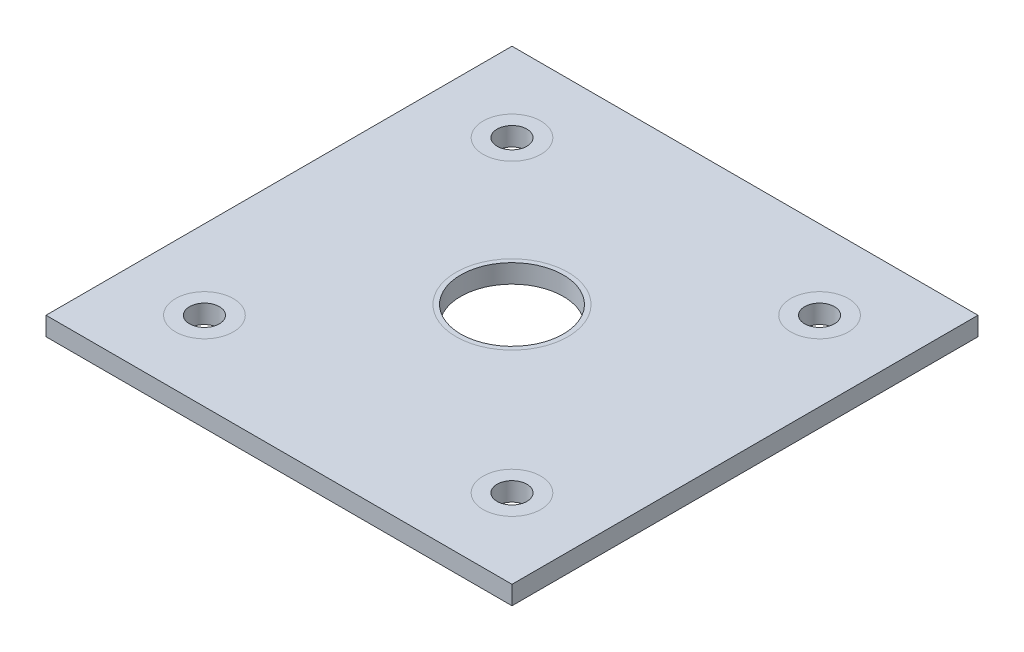
ISO-10303-21;
HEADER;
FILE_DESCRIPTION(('STEP AP214'),'2;1');
FILE_NAME('part.step','',(''),(''),'','','');
FILE_SCHEMA(('AUTOMOTIVE_DESIGN { 1 0 10303 214 1 1 1 1 }'));
ENDSEC;
DATA;
#1=APPLICATION_CONTEXT('core data for automotive mechanical design processes');
#2=APPLICATION_PROTOCOL_DEFINITION('international standard','automotive_design',2000,#1);
#3=PRODUCT_CONTEXT('',#1,'mechanical');
#4=PRODUCT('Part','Part','',(#3));
#5=PRODUCT_RELATED_PRODUCT_CATEGORY('part','',(#4));
#6=PRODUCT_DEFINITION_FORMATION('','',#4);
#7=PRODUCT_DEFINITION_CONTEXT('part definition',#1,'design');
#8=PRODUCT_DEFINITION('design','',#6,#7);
#9=PRODUCT_DEFINITION_SHAPE('','',#8);
#10=(LENGTH_UNIT() NAMED_UNIT(*) SI_UNIT(.MILLI.,.METRE.));
#11=(NAMED_UNIT(*) PLANE_ANGLE_UNIT() SI_UNIT($,.RADIAN.));
#12=(NAMED_UNIT(*) SI_UNIT($,.STERADIAN.) SOLID_ANGLE_UNIT());
#13=UNCERTAINTY_MEASURE_WITH_UNIT(LENGTH_MEASURE(1.E-05),#10,'distance_accuracy_value','');
#14=(GEOMETRIC_REPRESENTATION_CONTEXT(3) GLOBAL_UNCERTAINTY_ASSIGNED_CONTEXT((#13)) GLOBAL_UNIT_ASSIGNED_CONTEXT((#10,
#11,#12)) REPRESENTATION_CONTEXT('',''));
#15=CARTESIAN_POINT('',(0.,0.,0.));
#16=DIRECTION('',(0.,0.,1.));
#17=DIRECTION('',(1.,0.,0.));
#18=AXIS2_PLACEMENT_3D('',#15,#16,#17);
#19=CARTESIAN_POINT('',(23.252688172043,-2.,-35.013440860215));
#20=DIRECTION('',(0.,1.,0.));
#21=DIRECTION('',(0.,0.,1.));
#22=AXIS2_PLACEMENT_3D('',#19,#20,#21);
#23=PLANE('',#22);
#24=CARTESIAN_POINT('',(8.5,-2.,-41.5));
#25=DIRECTION('',(0.,1.,0.));
#26=DIRECTION('',(0.,0.,1.));
#27=AXIS2_PLACEMENT_3D('',#24,#25,#26);
#28=CIRCLE('',#27,3.1);
#29=CARTESIAN_POINT('',(8.5,-2.,-38.4));
#30=VERTEX_POINT('',#29);
#31=EDGE_CURVE('E148',#30,#30,#28,.F.);
#32=ORIENTED_EDGE('',*,*,#31,.F.);
#33=EDGE_LOOP('',(#32));
#34=FACE_BOUND('',#33,.T.);
#35=CARTESIAN_POINT('',(41.5,-2.,-8.50000000000035));
#36=DIRECTION('',(0.,1.,0.));
#37=DIRECTION('',(0.,0.,1.));
#38=AXIS2_PLACEMENT_3D('',#35,#36,#37);
#39=CIRCLE('',#38,3.1);
#40=CARTESIAN_POINT('',(41.5,-2.,-5.40000000000035));
#41=VERTEX_POINT('',#40);
#42=EDGE_CURVE('E132',#41,#41,#39,.F.);
#43=ORIENTED_EDGE('',*,*,#42,.F.);
#44=EDGE_LOOP('',(#43));
#45=FACE_BOUND('',#44,.T.);
#46=DIRECTION('',(0.,0.,1.));
#47=VECTOR('',#46,1.);
#48=CARTESIAN_POINT('',(0.,-2.,-50.));
#49=LINE('',#48,#47);
#50=CARTESIAN_POINT('',(0.,-2.,-50.));
#51=VERTEX_POINT('',#50);
#52=CARTESIAN_POINT('',(0.,-2.,0.));
#53=VERTEX_POINT('',#52);
#54=EDGE_CURVE('E113',#51,#53,#49,.T.);
#55=ORIENTED_EDGE('',*,*,#54,.F.);
#56=DIRECTION('',(-1.,0.,0.));
#57=VECTOR('',#56,1.);
#58=CARTESIAN_POINT('',(0.,-2.,-50.));
#59=LINE('',#58,#57);
#60=CARTESIAN_POINT('',(50.,-2.,-50.));
#61=VERTEX_POINT('',#60);
#62=EDGE_CURVE('E84',#61,#51,#59,.T.);
#63=ORIENTED_EDGE('',*,*,#62,.F.);
#64=DIRECTION('',(0.,0.,-1.));
#65=VECTOR('',#64,1.);
#66=CARTESIAN_POINT('',(50.,-2.,-50.));
#67=LINE('',#66,#65);
#68=CARTESIAN_POINT('',(50.,-2.,0.));
#69=VERTEX_POINT('',#68);
#70=EDGE_CURVE('E78',#69,#61,#67,.T.);
#71=ORIENTED_EDGE('',*,*,#70,.F.);
#72=DIRECTION('',(1.,0.,0.));
#73=VECTOR('',#72,1.);
#74=CARTESIAN_POINT('',(0.,-2.,0.));
#75=LINE('',#74,#73);
#76=EDGE_CURVE('E103',#53,#69,#75,.T.);
#77=ORIENTED_EDGE('',*,*,#76,.F.);
#78=EDGE_LOOP('',(#55,#63,#71,#77));
#79=FACE_BOUND('',#78,.T.);
#80=CARTESIAN_POINT('',(8.50000000000029,-2.,-8.50000000000017));
#81=DIRECTION('',(0.,1.,0.));
#82=DIRECTION('',(0.,0.,1.));
#83=AXIS2_PLACEMENT_3D('',#80,#81,#82);
#84=CIRCLE('',#83,3.1);
#85=CARTESIAN_POINT('',(8.50000000000029,-2.,-5.40000000000017));
#86=VERTEX_POINT('',#85);
#87=EDGE_CURVE('E124',#86,#86,#84,.F.);
#88=ORIENTED_EDGE('',*,*,#87,.F.);
#89=EDGE_LOOP('',(#88));
#90=FACE_BOUND('',#89,.T.);
#91=CARTESIAN_POINT('',(41.5,-2.,-41.5));
#92=DIRECTION('',(0.,1.,0.));
#93=DIRECTION('',(0.,0.,1.));
#94=AXIS2_PLACEMENT_3D('',#91,#92,#93);
#95=CIRCLE('',#94,3.1);
#96=CARTESIAN_POINT('',(41.5,-2.,-38.4));
#97=VERTEX_POINT('',#96);
#98=EDGE_CURVE('E140',#97,#97,#95,.F.);
#99=ORIENTED_EDGE('',*,*,#98,.F.);
#100=EDGE_LOOP('',(#99));
#101=FACE_BOUND('',#100,.T.);
#102=CARTESIAN_POINT('',(24.,-2.,-26.));
#103=DIRECTION('',(0.,1.,0.));
#104=DIRECTION('',(0.,0.,1.));
#105=AXIS2_PLACEMENT_3D('',#102,#103,#104);
#106=CIRCLE('',#105,6.00000000000001);
#107=CARTESIAN_POINT('',(24.,-2.,-20.));
#108=VERTEX_POINT('',#107);
#109=EDGE_CURVE('E11',#108,#108,#106,.F.);
#110=ORIENTED_EDGE('',*,*,#109,.F.);
#111=EDGE_LOOP('',(#110));
#112=FACE_BOUND('',#111,.T.);
#113=ADVANCED_FACE('F43',(#34,#45,#79,#90,#101,#112),#23,.F.);
#114=CARTESIAN_POINT('',(23.252688172043,0.,-35.013440860215));
#115=DIRECTION('',(0.,1.,0.));
#116=DIRECTION('',(0.,0.,1.));
#117=AXIS2_PLACEMENT_3D('',#114,#115,#116);
#118=PLANE('',#117);
#119=CARTESIAN_POINT('',(8.5,0.,-41.5));
#120=DIRECTION('',(0.,1.,0.));
#121=DIRECTION('',(0.,0.,1.));
#122=AXIS2_PLACEMENT_3D('',#119,#120,#121);
#123=CIRCLE('',#122,3.1);
#124=CARTESIAN_POINT('',(8.5,0.,-38.4));
#125=VERTEX_POINT('',#124);
#126=EDGE_CURVE('E144',#125,#125,#123,.F.);
#127=ORIENTED_EDGE('',*,*,#126,.T.);
#128=EDGE_LOOP('',(#127));
#129=FACE_BOUND('',#128,.T.);
#130=CARTESIAN_POINT('',(41.5,0.,-8.50000000000035));
#131=DIRECTION('',(0.,1.,0.));
#132=DIRECTION('',(0.,0.,1.));
#133=AXIS2_PLACEMENT_3D('',#130,#131,#132);
#134=CIRCLE('',#133,3.1);
#135=CARTESIAN_POINT('',(41.5,0.,-5.40000000000035));
#136=VERTEX_POINT('',#135);
#137=EDGE_CURVE('E128',#136,#136,#134,.F.);
#138=ORIENTED_EDGE('',*,*,#137,.T.);
#139=EDGE_LOOP('',(#138));
#140=FACE_BOUND('',#139,.T.);
#141=DIRECTION('',(0.,0.,1.));
#142=VECTOR('',#141,1.);
#143=CARTESIAN_POINT('',(0.,0.,-50.));
#144=LINE('',#143,#142);
#145=CARTESIAN_POINT('',(0.,0.,-50.));
#146=VERTEX_POINT('',#145);
#147=CARTESIAN_POINT('',(0.,0.,0.));
#148=VERTEX_POINT('',#147);
#149=EDGE_CURVE('E98',#146,#148,#144,.T.);
#150=ORIENTED_EDGE('',*,*,#149,.T.);
#151=DIRECTION('',(1.,0.,0.));
#152=VECTOR('',#151,1.);
#153=CARTESIAN_POINT('',(0.,0.,0.));
#154=LINE('',#153,#152);
#155=CARTESIAN_POINT('',(50.,0.,0.));
#156=VERTEX_POINT('',#155);
#157=EDGE_CURVE('E92',#148,#156,#154,.T.);
#158=ORIENTED_EDGE('',*,*,#157,.T.);
#159=DIRECTION('',(0.,0.,-1.));
#160=VECTOR('',#159,1.);
#161=CARTESIAN_POINT('',(50.,0.,-50.));
#162=LINE('',#161,#160);
#163=CARTESIAN_POINT('',(50.,0.,-50.));
#164=VERTEX_POINT('',#163);
#165=EDGE_CURVE('E96',#156,#164,#162,.T.);
#166=ORIENTED_EDGE('',*,*,#165,.T.);
#167=DIRECTION('',(-1.,0.,0.));
#168=VECTOR('',#167,1.);
#169=CARTESIAN_POINT('',(0.,0.,-50.));
#170=LINE('',#169,#168);
#171=EDGE_CURVE('E61',#164,#146,#170,.T.);
#172=ORIENTED_EDGE('',*,*,#171,.T.);
#173=EDGE_LOOP('',(#150,#158,#166,#172));
#174=FACE_BOUND('',#173,.T.);
#175=CARTESIAN_POINT('',(8.50000000000029,0.,-8.50000000000017));
#176=DIRECTION('',(0.,1.,0.));
#177=DIRECTION('',(0.,0.,1.));
#178=AXIS2_PLACEMENT_3D('',#175,#176,#177);
#179=CIRCLE('',#178,3.1);
#180=CARTESIAN_POINT('',(8.50000000000029,0.,-5.40000000000017));
#181=VERTEX_POINT('',#180);
#182=EDGE_CURVE('E123',#181,#181,#179,.F.);
#183=ORIENTED_EDGE('',*,*,#182,.T.);
#184=EDGE_LOOP('',(#183));
#185=FACE_BOUND('',#184,.T.);
#186=CARTESIAN_POINT('',(41.5,0.,-41.5));
#187=DIRECTION('',(0.,1.,0.));
#188=DIRECTION('',(0.,0.,1.));
#189=AXIS2_PLACEMENT_3D('',#186,#187,#188);
#190=CIRCLE('',#189,3.1);
#191=CARTESIAN_POINT('',(41.5,0.,-38.4));
#192=VERTEX_POINT('',#191);
#193=EDGE_CURVE('E136',#192,#192,#190,.F.);
#194=ORIENTED_EDGE('',*,*,#193,.T.);
#195=EDGE_LOOP('',(#194));
#196=FACE_BOUND('',#195,.T.);
#197=CARTESIAN_POINT('',(24.,0.,-26.));
#198=DIRECTION('',(0.,1.,0.));
#199=DIRECTION('',(0.,0.,1.));
#200=AXIS2_PLACEMENT_3D('',#197,#198,#199);
#201=CIRCLE('',#200,6.00000000000001);
#202=CARTESIAN_POINT('',(24.,0.,-20.));
#203=VERTEX_POINT('',#202);
#204=EDGE_CURVE('E47',#203,#203,#201,.F.);
#205=ORIENTED_EDGE('',*,*,#204,.T.);
#206=EDGE_LOOP('',(#205));
#207=FACE_BOUND('',#206,.T.);
#208=ADVANCED_FACE('F93',(#129,#140,#174,#185,#196,#207),#118,.T.);
#209=ORIENTED_EDGE('',*,*,#109,.T.);
#210=EDGE_LOOP('',(#209));
#211=FACE_BOUND('',#210,.T.);
#212=CARTESIAN_POINT('',(24.,-2.,-26.));
#213=DIRECTION('',(0.,1.,0.));
#214=DIRECTION('',(0.,0.,1.));
#215=AXIS2_PLACEMENT_3D('',#212,#213,#214);
#216=CIRCLE('',#215,5.5);
#217=CARTESIAN_POINT('',(24.,-2.,-20.5));
#218=VERTEX_POINT('',#217);
#219=EDGE_CURVE('E116',#218,#218,#216,.T.);
#220=ORIENTED_EDGE('',*,*,#219,.T.);
#221=EDGE_LOOP('',(#220));
#222=FACE_BOUND('',#221,.T.);
#223=ADVANCED_FACE('F204',(#211,#222),#23,.F.);
#224=ORIENTED_EDGE('',*,*,#204,.F.);
#225=EDGE_LOOP('',(#224));
#226=FACE_BOUND('',#225,.T.);
#227=CARTESIAN_POINT('',(24.,0.,-26.));
#228=DIRECTION('',(0.,1.,0.));
#229=DIRECTION('',(0.,0.,1.));
#230=AXIS2_PLACEMENT_3D('',#227,#228,#229);
#231=CIRCLE('',#230,5.5);
#232=CARTESIAN_POINT('',(24.,0.,-20.5));
#233=VERTEX_POINT('',#232);
#234=EDGE_CURVE('E195',#233,#233,#231,.T.);
#235=ORIENTED_EDGE('',*,*,#234,.F.);
#236=EDGE_LOOP('',(#235));
#237=FACE_BOUND('',#236,.T.);
#238=ADVANCED_FACE('F167',(#226,#237),#118,.T.);
#239=ORIENTED_EDGE('',*,*,#31,.T.);
#240=EDGE_LOOP('',(#239));
#241=FACE_BOUND('',#240,.T.);
#242=CARTESIAN_POINT('',(8.5,-2.,-41.5));
#243=DIRECTION('',(0.,1.,0.));
#244=DIRECTION('',(0.,0.,1.));
#245=AXIS2_PLACEMENT_3D('',#242,#243,#244);
#246=CIRCLE('',#245,1.6);
#247=CARTESIAN_POINT('',(8.5,-2.,-39.9));
#248=VERTEX_POINT('',#247);
#249=EDGE_CURVE('E172',#248,#248,#246,.T.);
#250=ORIENTED_EDGE('',*,*,#249,.T.);
#251=EDGE_LOOP('',(#250));
#252=FACE_BOUND('',#251,.T.);
#253=ADVANCED_FACE('F164',(#241,#252),#23,.F.);
#254=ORIENTED_EDGE('',*,*,#126,.F.);
#255=EDGE_LOOP('',(#254));
#256=FACE_BOUND('',#255,.T.);
#257=CARTESIAN_POINT('',(8.5,0.,-41.5));
#258=DIRECTION('',(0.,1.,0.));
#259=DIRECTION('',(0.,0.,1.));
#260=AXIS2_PLACEMENT_3D('',#257,#258,#259);
#261=CIRCLE('',#260,1.6);
#262=CARTESIAN_POINT('',(8.5,0.,-39.9));
#263=VERTEX_POINT('',#262);
#264=EDGE_CURVE('E170',#263,#263,#261,.T.);
#265=ORIENTED_EDGE('',*,*,#264,.F.);
#266=EDGE_LOOP('',(#265));
#267=FACE_BOUND('',#266,.T.);
#268=ADVANCED_FACE('F160',(#256,#267),#118,.T.);
#269=ORIENTED_EDGE('',*,*,#98,.T.);
#270=EDGE_LOOP('',(#269));
#271=FACE_BOUND('',#270,.T.);
#272=CARTESIAN_POINT('',(41.5,-2.,-41.5));
#273=DIRECTION('',(0.,1.,0.));
#274=DIRECTION('',(0.,0.,1.));
#275=AXIS2_PLACEMENT_3D('',#272,#273,#274);
#276=CIRCLE('',#275,1.6);
#277=CARTESIAN_POINT('',(41.5,-2.,-39.9));
#278=VERTEX_POINT('',#277);
#279=EDGE_CURVE('E180',#278,#278,#276,.T.);
#280=ORIENTED_EDGE('',*,*,#279,.T.);
#281=EDGE_LOOP('',(#280));
#282=FACE_BOUND('',#281,.T.);
#283=ADVANCED_FACE('F163',(#271,#282),#23,.F.);
#284=ORIENTED_EDGE('',*,*,#193,.F.);
#285=EDGE_LOOP('',(#284));
#286=FACE_BOUND('',#285,.T.);
#287=CARTESIAN_POINT('',(41.5,0.,-41.5));
#288=DIRECTION('',(0.,1.,0.));
#289=DIRECTION('',(0.,0.,1.));
#290=AXIS2_PLACEMENT_3D('',#287,#288,#289);
#291=CIRCLE('',#290,1.6);
#292=CARTESIAN_POINT('',(41.5,0.,-39.9));
#293=VERTEX_POINT('',#292);
#294=EDGE_CURVE('E175',#293,#293,#291,.T.);
#295=ORIENTED_EDGE('',*,*,#294,.F.);
#296=EDGE_LOOP('',(#295));
#297=FACE_BOUND('',#296,.T.);
#298=ADVANCED_FACE('F166',(#286,#297),#118,.T.);
#299=ORIENTED_EDGE('',*,*,#42,.T.);
#300=EDGE_LOOP('',(#299));
#301=FACE_BOUND('',#300,.T.);
#302=CARTESIAN_POINT('',(41.5,-2.,-8.50000000000035));
#303=DIRECTION('',(0.,1.,0.));
#304=DIRECTION('',(0.,0.,1.));
#305=AXIS2_PLACEMENT_3D('',#302,#303,#304);
#306=CIRCLE('',#305,1.6);
#307=CARTESIAN_POINT('',(41.5,-2.,-6.90000000000035));
#308=VERTEX_POINT('',#307);
#309=EDGE_CURVE('E192',#308,#308,#306,.T.);
#310=ORIENTED_EDGE('',*,*,#309,.T.);
#311=EDGE_LOOP('',(#310));
#312=FACE_BOUND('',#311,.T.);
#313=ADVANCED_FACE('F228',(#301,#312),#23,.F.);
#314=ORIENTED_EDGE('',*,*,#137,.F.);
#315=EDGE_LOOP('',(#314));
#316=FACE_BOUND('',#315,.T.);
#317=CARTESIAN_POINT('',(41.5,0.,-8.50000000000035));
#318=DIRECTION('',(0.,1.,0.));
#319=DIRECTION('',(0.,0.,1.));
#320=AXIS2_PLACEMENT_3D('',#317,#318,#319);
#321=CIRCLE('',#320,1.6);
#322=CARTESIAN_POINT('',(41.5,0.,-6.90000000000035));
#323=VERTEX_POINT('',#322);
#324=EDGE_CURVE('E189',#323,#323,#321,.T.);
#325=ORIENTED_EDGE('',*,*,#324,.F.);
#326=EDGE_LOOP('',(#325));
#327=FACE_BOUND('',#326,.T.);
#328=ADVANCED_FACE('F238',(#316,#327),#118,.T.);
#329=CARTESIAN_POINT('',(0.,0.,-50.));
#330=DIRECTION('',(1.,0.,0.));
#331=DIRECTION('',(0.,0.,-1.));
#332=AXIS2_PLACEMENT_3D('',#329,#330,#331);
#333=PLANE('',#332);
#334=ORIENTED_EDGE('',*,*,#54,.T.);
#335=DIRECTION('',(0.,-1.,0.));
#336=VECTOR('',#335,1.);
#337=CARTESIAN_POINT('',(0.,0.,0.));
#338=LINE('',#337,#336);
#339=EDGE_CURVE('E104',#148,#53,#338,.T.);
#340=ORIENTED_EDGE('',*,*,#339,.F.);
#341=ORIENTED_EDGE('',*,*,#149,.F.);
#342=DIRECTION('',(0.,-1.,0.));
#343=VECTOR('',#342,1.);
#344=CARTESIAN_POINT('',(0.,0.,-50.));
#345=LINE('',#344,#343);
#346=EDGE_CURVE('E109',#146,#51,#345,.T.);
#347=ORIENTED_EDGE('',*,*,#346,.T.);
#348=EDGE_LOOP('',(#334,#340,#341,#347));
#349=FACE_BOUND('',#348,.T.);
#350=ADVANCED_FACE('F45',(#349),#333,.F.);
#351=CARTESIAN_POINT('',(0.,0.,0.));
#352=DIRECTION('',(0.,0.,-1.));
#353=DIRECTION('',(-1.,0.,0.));
#354=AXIS2_PLACEMENT_3D('',#351,#352,#353);
#355=PLANE('',#354);
#356=ORIENTED_EDGE('',*,*,#76,.T.);
#357=DIRECTION('',(0.,-1.,0.));
#358=VECTOR('',#357,1.);
#359=CARTESIAN_POINT('',(50.,0.,0.));
#360=LINE('',#359,#358);
#361=EDGE_CURVE('E101',#156,#69,#360,.T.);
#362=ORIENTED_EDGE('',*,*,#361,.F.);
#363=ORIENTED_EDGE('',*,*,#157,.F.);
#364=ORIENTED_EDGE('',*,*,#339,.T.);
#365=EDGE_LOOP('',(#356,#362,#363,#364));
#366=FACE_BOUND('',#365,.T.);
#367=ADVANCED_FACE('F102',(#366),#355,.F.);
#368=CARTESIAN_POINT('',(50.,0.,-50.));
#369=DIRECTION('',(-1.,0.,0.));
#370=DIRECTION('',(0.,0.,1.));
#371=AXIS2_PLACEMENT_3D('',#368,#369,#370);
#372=PLANE('',#371);
#373=ORIENTED_EDGE('',*,*,#70,.T.);
#374=DIRECTION('',(0.,-1.,0.));
#375=VECTOR('',#374,1.);
#376=CARTESIAN_POINT('',(50.,0.,-50.));
#377=LINE('',#376,#375);
#378=EDGE_CURVE('E105',#164,#61,#377,.T.);
#379=ORIENTED_EDGE('',*,*,#378,.F.);
#380=ORIENTED_EDGE('',*,*,#165,.F.);
#381=ORIENTED_EDGE('',*,*,#361,.T.);
#382=EDGE_LOOP('',(#373,#379,#380,#381));
#383=FACE_BOUND('',#382,.T.);
#384=ADVANCED_FACE('F107',(#383),#372,.F.);
#385=CARTESIAN_POINT('',(0.,0.,-50.));
#386=DIRECTION('',(0.,0.,1.));
#387=DIRECTION('',(1.,0.,0.));
#388=AXIS2_PLACEMENT_3D('',#385,#386,#387);
#389=PLANE('',#388);
#390=ORIENTED_EDGE('',*,*,#62,.T.);
#391=ORIENTED_EDGE('',*,*,#346,.F.);
#392=ORIENTED_EDGE('',*,*,#171,.F.);
#393=ORIENTED_EDGE('',*,*,#378,.T.);
#394=EDGE_LOOP('',(#390,#391,#392,#393));
#395=FACE_BOUND('',#394,.T.);
#396=ADVANCED_FACE('F236',(#395),#389,.F.);
#397=ORIENTED_EDGE('',*,*,#182,.F.);
#398=EDGE_LOOP('',(#397));
#399=FACE_BOUND('',#398,.T.);
#400=CARTESIAN_POINT('',(8.50000000000029,0.,-8.50000000000017));
#401=DIRECTION('',(0.,1.,0.));
#402=DIRECTION('',(0.,0.,1.));
#403=AXIS2_PLACEMENT_3D('',#400,#401,#402);
#404=CIRCLE('',#403,1.6);
#405=CARTESIAN_POINT('',(8.50000000000029,0.,-6.90000000000017));
#406=VERTEX_POINT('',#405);
#407=EDGE_CURVE('E183',#406,#406,#404,.T.);
#408=ORIENTED_EDGE('',*,*,#407,.F.);
#409=EDGE_LOOP('',(#408));
#410=FACE_BOUND('',#409,.T.);
#411=ADVANCED_FACE('F214',(#399,#410),#118,.T.);
#412=ORIENTED_EDGE('',*,*,#87,.T.);
#413=EDGE_LOOP('',(#412));
#414=FACE_BOUND('',#413,.T.);
#415=CARTESIAN_POINT('',(8.50000000000029,-2.,-8.50000000000017));
#416=DIRECTION('',(0.,1.,0.));
#417=DIRECTION('',(0.,0.,1.));
#418=AXIS2_PLACEMENT_3D('',#415,#416,#417);
#419=CIRCLE('',#418,1.6);
#420=CARTESIAN_POINT('',(8.50000000000029,-2.,-6.90000000000017));
#421=VERTEX_POINT('',#420);
#422=EDGE_CURVE('E186',#421,#421,#419,.T.);
#423=ORIENTED_EDGE('',*,*,#422,.T.);
#424=EDGE_LOOP('',(#423));
#425=FACE_BOUND('',#424,.T.);
#426=ADVANCED_FACE('F219',(#414,#425),#23,.F.);
#427=CARTESIAN_POINT('',(24.,-2.,-26.));
#428=DIRECTION('',(0.,1.,0.));
#429=DIRECTION('',(0.,0.,1.));
#430=AXIS2_PLACEMENT_3D('',#427,#428,#429);
#431=CYLINDRICAL_SURFACE('',#430,5.5);
#432=ORIENTED_EDGE('',*,*,#219,.F.);
#433=EDGE_LOOP('',(#432));
#434=FACE_BOUND('',#433,.T.);
#435=ORIENTED_EDGE('',*,*,#234,.T.);
#436=EDGE_LOOP('',(#435));
#437=FACE_BOUND('',#436,.T.);
#438=ADVANCED_FACE('F201',(#434,#437),#431,.F.);
#439=CARTESIAN_POINT('',(41.5,0.,-8.50000000000035));
#440=DIRECTION('',(0.,1.,0.));
#441=DIRECTION('',(0.,0.,1.));
#442=AXIS2_PLACEMENT_3D('',#439,#440,#441);
#443=CYLINDRICAL_SURFACE('',#442,1.6);
#444=ORIENTED_EDGE('',*,*,#309,.F.);
#445=EDGE_LOOP('',(#444));
#446=FACE_BOUND('',#445,.T.);
#447=ORIENTED_EDGE('',*,*,#324,.T.);
#448=EDGE_LOOP('',(#447));
#449=FACE_BOUND('',#448,.T.);
#450=ADVANCED_FACE('F233',(#446,#449),#443,.F.);
#451=CARTESIAN_POINT('',(8.50000000000029,0.,-8.50000000000017));
#452=DIRECTION('',(0.,1.,0.));
#453=DIRECTION('',(0.,0.,1.));
#454=AXIS2_PLACEMENT_3D('',#451,#452,#453);
#455=CYLINDRICAL_SURFACE('',#454,1.6);
#456=ORIENTED_EDGE('',*,*,#422,.F.);
#457=EDGE_LOOP('',(#456));
#458=FACE_BOUND('',#457,.T.);
#459=ORIENTED_EDGE('',*,*,#407,.T.);
#460=EDGE_LOOP('',(#459));
#461=FACE_BOUND('',#460,.T.);
#462=ADVANCED_FACE('F259',(#458,#461),#455,.F.);
#463=CARTESIAN_POINT('',(41.5,0.,-41.5));
#464=DIRECTION('',(0.,1.,0.));
#465=DIRECTION('',(0.,0.,1.));
#466=AXIS2_PLACEMENT_3D('',#463,#464,#465);
#467=CYLINDRICAL_SURFACE('',#466,1.6);
#468=ORIENTED_EDGE('',*,*,#279,.F.);
#469=EDGE_LOOP('',(#468));
#470=FACE_BOUND('',#469,.T.);
#471=ORIENTED_EDGE('',*,*,#294,.T.);
#472=EDGE_LOOP('',(#471));
#473=FACE_BOUND('',#472,.T.);
#474=ADVANCED_FACE('F255',(#470,#473),#467,.F.);
#475=CARTESIAN_POINT('',(8.5,0.,-41.5));
#476=DIRECTION('',(0.,1.,0.));
#477=DIRECTION('',(0.,0.,1.));
#478=AXIS2_PLACEMENT_3D('',#475,#476,#477);
#479=CYLINDRICAL_SURFACE('',#478,1.6);
#480=ORIENTED_EDGE('',*,*,#249,.F.);
#481=EDGE_LOOP('',(#480));
#482=FACE_BOUND('',#481,.T.);
#483=ORIENTED_EDGE('',*,*,#264,.T.);
#484=EDGE_LOOP('',(#483));
#485=FACE_BOUND('',#484,.T.);
#486=ADVANCED_FACE('F258',(#482,#485),#479,.F.);
#487=CLOSED_SHELL('',(#113,#208,#223,#238,#253,#268,#283,#298,#313,#328,#350,#367,#384,#396,
#411,#426,#438,#450,#462,#474,#486));
#488=MANIFOLD_SOLID_BREP('B2',#487);
#489=ADVANCED_BREP_SHAPE_REPRESENTATION('',(#18,#488),#14);
#490=SHAPE_DEFINITION_REPRESENTATION(#9,#489);
ENDSEC;
END-ISO-10303-21;
